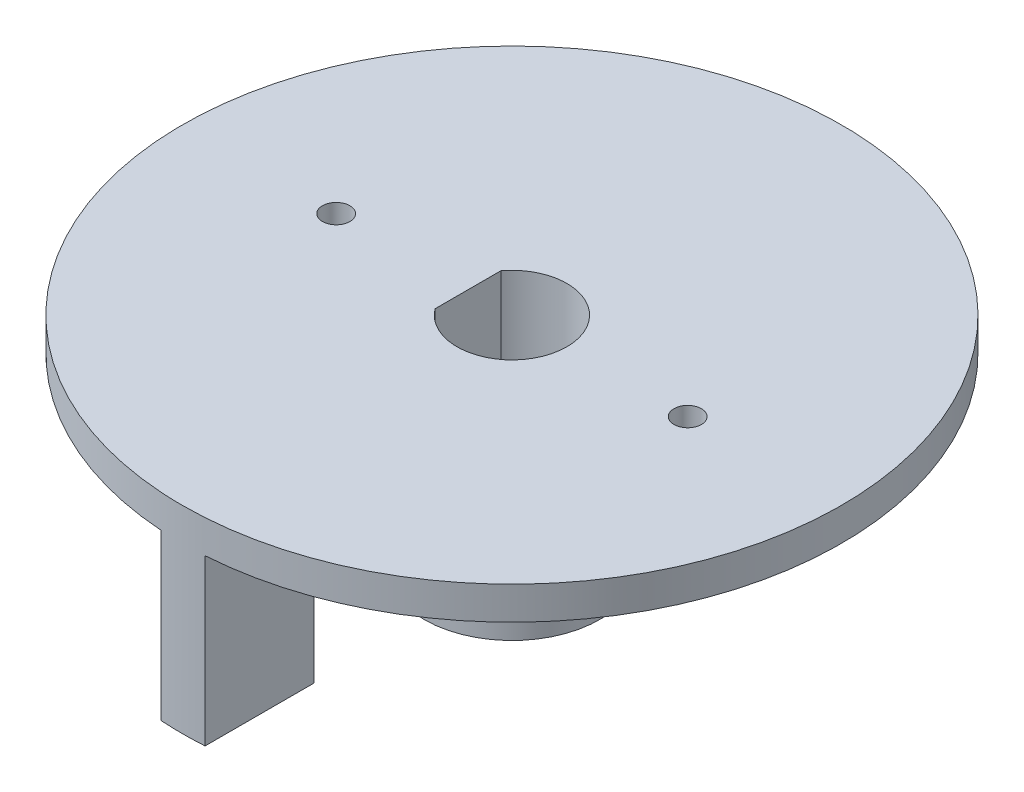
ISO-10303-21;
HEADER;
FILE_DESCRIPTION(('STEP AP214'),'2;1');
FILE_NAME('part.step','',(''),(''),'','','');
FILE_SCHEMA(('AUTOMOTIVE_DESIGN { 1 0 10303 214 1 1 1 1 }'));
ENDSEC;
DATA;
#1=APPLICATION_CONTEXT('core data for automotive mechanical design processes');
#2=APPLICATION_PROTOCOL_DEFINITION('international standard','automotive_design',2000,#1);
#3=PRODUCT_CONTEXT('',#1,'mechanical');
#4=PRODUCT('Part','Part','',(#3));
#5=PRODUCT_RELATED_PRODUCT_CATEGORY('part','',(#4));
#6=PRODUCT_DEFINITION_FORMATION('','',#4);
#7=PRODUCT_DEFINITION_CONTEXT('part definition',#1,'design');
#8=PRODUCT_DEFINITION('design','',#6,#7);
#9=PRODUCT_DEFINITION_SHAPE('','',#8);
#10=(LENGTH_UNIT() NAMED_UNIT(*) SI_UNIT(.MILLI.,.METRE.));
#11=(NAMED_UNIT(*) PLANE_ANGLE_UNIT() SI_UNIT($,.RADIAN.));
#12=(NAMED_UNIT(*) SI_UNIT($,.STERADIAN.) SOLID_ANGLE_UNIT());
#13=UNCERTAINTY_MEASURE_WITH_UNIT(LENGTH_MEASURE(1.E-05),#10,'distance_accuracy_value','');
#14=(GEOMETRIC_REPRESENTATION_CONTEXT(3) GLOBAL_UNCERTAINTY_ASSIGNED_CONTEXT((#13)) GLOBAL_UNIT_ASSIGNED_CONTEXT((#10,
#11,#12)) REPRESENTATION_CONTEXT('',''));
#15=CARTESIAN_POINT('',(0.,0.,0.));
#16=DIRECTION('',(0.,0.,1.));
#17=DIRECTION('',(1.,0.,0.));
#18=AXIS2_PLACEMENT_3D('',#15,#16,#17);
#19=CARTESIAN_POINT('',(0.,17.,0.));
#20=DIRECTION('',(0.,1.,0.));
#21=DIRECTION('',(0.,0.,1.));
#22=AXIS2_PLACEMENT_3D('',#19,#20,#21);
#23=PLANE('',#22);
#24=CARTESIAN_POINT('',(-16.,17.,0.));
#25=DIRECTION('',(0.,1.,0.));
#26=DIRECTION('',(0.,0.,1.));
#27=AXIS2_PLACEMENT_3D('',#24,#25,#26);
#28=CIRCLE('',#27,1.25);
#29=CARTESIAN_POINT('',(-16.,17.,1.25));
#30=VERTEX_POINT('',#29);
#31=EDGE_CURVE('E378',#30,#30,#28,.T.);
#32=ORIENTED_EDGE('',*,*,#31,.T.);
#33=EDGE_LOOP('',(#32));
#34=FACE_BOUND('',#33,.T.);
#35=CARTESIAN_POINT('',(16.,17.,0.));
#36=DIRECTION('',(0.,1.,0.));
#37=DIRECTION('',(0.,0.,1.));
#38=AXIS2_PLACEMENT_3D('',#35,#36,#37);
#39=CIRCLE('',#38,1.25);
#40=CARTESIAN_POINT('',(16.,17.,1.25000000000001));
#41=VERTEX_POINT('',#40);
#42=EDGE_CURVE('E382',#41,#41,#39,.T.);
#43=ORIENTED_EDGE('',*,*,#42,.T.);
#44=EDGE_LOOP('',(#43));
#45=FACE_BOUND('',#44,.T.);
#46=CARTESIAN_POINT('',(0.,17.,0.));
#47=DIRECTION('',(0.,1.,0.));
#48=DIRECTION('',(0.,0.,1.));
#49=AXIS2_PLACEMENT_3D('',#46,#47,#48);
#50=CIRCLE('',#49,11.);
#51=CARTESIAN_POINT('',(0.,17.,11.));
#52=VERTEX_POINT('',#51);
#53=EDGE_CURVE('E53',#52,#52,#50,.T.);
#54=ORIENTED_EDGE('',*,*,#53,.T.);
#55=EDGE_LOOP('',(#54));
#56=FACE_BOUND('',#55,.T.);
#57=DIRECTION('',(0.,0.,1.));
#58=VECTOR('',#57,1.);
#59=CARTESIAN_POINT('',(2.,17.,20.));
#60=LINE('',#59,#58);
#61=CARTESIAN_POINT('',(2.,17.,20.));
#62=VERTEX_POINT('',#61);
#63=CARTESIAN_POINT('',(2.,17.,29.9332590941915));
#64=VERTEX_POINT('',#63);
#65=EDGE_CURVE('E117',#62,#64,#60,.T.);
#66=ORIENTED_EDGE('',*,*,#65,.F.);
#67=DIRECTION('',(1.,0.,0.));
#68=VECTOR('',#67,1.);
#69=CARTESIAN_POINT('',(-2.,17.,20.));
#70=LINE('',#69,#68);
#71=CARTESIAN_POINT('',(-2.,17.,20.));
#72=VERTEX_POINT('',#71);
#73=EDGE_CURVE('E62',#72,#62,#70,.T.);
#74=ORIENTED_EDGE('',*,*,#73,.F.);
#75=DIRECTION('',(0.,0.,-1.));
#76=VECTOR('',#75,1.);
#77=CARTESIAN_POINT('',(-2.,17.,29.9332590941915));
#78=LINE('',#77,#76);
#79=CARTESIAN_POINT('',(-2.,17.,29.9332590941915));
#80=VERTEX_POINT('',#79);
#81=EDGE_CURVE('E63',#80,#72,#78,.T.);
#82=ORIENTED_EDGE('',*,*,#81,.F.);
#83=CARTESIAN_POINT('',(0.,17.,0.));
#84=DIRECTION('',(0.,1.,0.));
#85=DIRECTION('',(0.,0.,1.));
#86=AXIS2_PLACEMENT_3D('',#83,#84,#85);
#87=CIRCLE('',#86,30.);
#88=EDGE_CURVE('E122',#64,#80,#87,.T.);
#89=ORIENTED_EDGE('',*,*,#88,.F.);
#90=EDGE_LOOP('',(#66,#74,#82,#89));
#91=FACE_BOUND('',#90,.T.);
#92=ADVANCED_FACE('F44',(#34,#45,#56,#91),#23,.F.);
#93=CARTESIAN_POINT('',(0.,17.,0.));
#94=DIRECTION('',(0.,-1.,0.));
#95=DIRECTION('',(0.,0.,-1.));
#96=AXIS2_PLACEMENT_3D('',#93,#94,#95);
#97=CYLINDRICAL_SURFACE('',#96,8.);
#98=CARTESIAN_POINT('',(0.,14.,0.));
#99=DIRECTION('',(0.,1.,0.));
#100=DIRECTION('',(0.,0.,1.));
#101=AXIS2_PLACEMENT_3D('',#98,#99,#100);
#102=CIRCLE('',#101,8.);
#103=CARTESIAN_POINT('',(0.,14.,8.));
#104=VERTEX_POINT('',#103);
#105=EDGE_CURVE('E11',#104,#104,#102,.F.);
#106=ORIENTED_EDGE('',*,*,#105,.T.);
#107=EDGE_LOOP('',(#106));
#108=FACE_BOUND('',#107,.T.);
#109=CARTESIAN_POINT('',(-7.91691227689179,10.,-1.15));
#110=CARTESIAN_POINT('',(-7.91691331520906,10.0642369391452,-1.14999732438545));
#111=CARTESIAN_POINT('',(-7.91770254931004,10.128511931939,-1.144599569323));
#112=CARTESIAN_POINT('',(-7.92077232494378,10.2552670699662,-1.1231556401071));
#113=CARTESIAN_POINT('',(-7.92305434871607,10.3177453667638,-1.10709888204727));
#114=CARTESIAN_POINT('',(-7.9288460143981,10.439053894653,-1.06482535284323));
#115=CARTESIAN_POINT('',(-7.93235474310169,10.497886801264,-1.03861613801409));
#116=CARTESIAN_POINT('',(-7.94020338539103,10.6103106271357,-0.976799069701961));
#117=CARTESIAN_POINT('',(-7.94454317718202,10.6639023127763,-0.941192593126768));
#118=CARTESIAN_POINT('',(-7.95360069692159,10.7647259829688,-0.86131160021349));
#119=CARTESIAN_POINT('',(-7.95832072442867,10.8119137863557,-0.816981573552691));
#120=CARTESIAN_POINT('',(-7.96758632503875,10.8982076555134,-0.721031642933757));
#121=CARTESIAN_POINT('',(-7.97213188878928,10.9373132885147,-0.66941134885869));
#122=CARTESIAN_POINT('',(-7.98056033885178,11.0064946675033,-0.56006443667014));
#123=CARTESIAN_POINT('',(-7.98444021937064,11.0365298980851,-0.502311933930787));
#124=CARTESIAN_POINT('',(-7.99107472364296,11.0864580183223,-0.382517036458336));
#125=CARTESIAN_POINT('',(-7.99382940210799,11.1063514011243,-0.320474850477416));
#126=CARTESIAN_POINT('',(-7.99788690770617,11.1352976609833,-0.194316061864047));
#127=CARTESIAN_POINT('',(-7.99919962364701,11.1444244067257,-0.130216731061572));
#128=CARTESIAN_POINT('',(-8.00025915735781,11.1518075687,-0.00138385812618422));
#129=CARTESIAN_POINT('',(-8.00000605540388,11.1500645422018,0.0633496513238747));
#130=CARTESIAN_POINT('',(-7.99797039844107,11.1358161725996,0.19110973215991));
#131=CARTESIAN_POINT('',(-7.99619913641842,11.1233902928918,0.254145371074535));
#132=CARTESIAN_POINT('',(-7.9913387737999,11.0882535369491,0.377227395159526));
#133=CARTESIAN_POINT('',(-7.98824964156645,11.0655424137997,0.43727370852768));
#134=CARTESIAN_POINT('',(-7.9810811912617,11.010397670316,0.552914565752285));
#135=CARTESIAN_POINT('',(-7.97699845038006,10.9779303488046,0.608492817988313));
#136=CARTESIAN_POINT('',(-7.96829827749924,10.9042194162766,0.713442226508403));
#137=CARTESIAN_POINT('',(-7.96368081314635,10.8629752740873,0.762813006828844));
#138=CARTESIAN_POINT('',(-7.95437739097788,10.7724381497289,0.854414022190045));
#139=CARTESIAN_POINT('',(-7.94969119123861,10.7230758202025,0.896575720017902));
#140=CARTESIAN_POINT('',(-7.94081927869157,10.6179398365453,0.972027236299373));
#141=CARTESIAN_POINT('',(-7.93663356850871,10.562166148792,1.00531700822374));
#142=CARTESIAN_POINT('',(-7.92923667281946,10.4457219948527,1.06208752193494));
#143=CARTESIAN_POINT('',(-7.92602614627103,10.3850482524587,1.08556163503201));
#144=CARTESIAN_POINT('',(-7.92095508424149,10.260563173039,1.12196772770523));
#145=CARTESIAN_POINT('',(-7.91909446174244,10.1967520385402,1.13490038681458));
#146=CARTESIAN_POINT('',(-7.9169502367997,10.0684121306809,1.14976332897848));
#147=CARTESIAN_POINT('',(-7.91665273604437,10.0038948110501,1.15179058004305));
#148=CARTESIAN_POINT('',(-7.917631578822,9.87544138112265,1.14504207504783));
#149=CARTESIAN_POINT('',(-7.91890787763385,9.81150525436278,1.13626662595777));
#150=CARTESIAN_POINT('',(-7.92287776940873,9.68632690464793,1.10824390898525));
#151=CARTESIAN_POINT('',(-7.92556487113637,9.62507372424302,1.08904458862154));
#152=CARTESIAN_POINT('',(-7.93204827407153,9.50665520159963,1.04076886373188));
#153=CARTESIAN_POINT('',(-7.93584462591673,9.44949004612939,1.01169200828278));
#154=CARTESIAN_POINT('',(-7.94415166954795,9.34043452421327,0.944252175782423));
#155=CARTESIAN_POINT('',(-7.94866713182425,9.28858347972317,0.905826209647775));
#156=CARTESIAN_POINT('',(-7.95788909393117,9.19203146004691,0.820866883751198));
#157=CARTESIAN_POINT('',(-7.96259560364705,9.14733085543422,0.774333104060587));
#158=CARTESIAN_POINT('',(-7.97171260025748,9.06600238778433,0.674052940592975));
#159=CARTESIAN_POINT('',(-7.97612055780339,9.0294386434563,0.620254292113599));
#160=CARTESIAN_POINT('',(-7.98410489886545,8.96586770759003,0.50722225924468));
#161=CARTESIAN_POINT('',(-7.98768130359466,8.93886027225935,0.447989013546522));
#162=CARTESIAN_POINT('',(-7.99358845745418,8.89527196617406,0.325972801286979));
#163=CARTESIAN_POINT('',(-7.9959234540396,8.87865550803317,0.26320276201097));
#164=CARTESIAN_POINT('',(-7.99910248180935,8.85620549225942,0.135727447514538));
#165=CARTESIAN_POINT('',(-7.99994660309167,8.85037128302245,0.0710222894793985));
#166=CARTESIAN_POINT('',(-8.00004799610185,8.84966628649042,-0.0578635463329459));
#167=CARTESIAN_POINT('',(-7.99931949659493,8.85469719392889,-0.122043696997265));
#168=CARTESIAN_POINT('',(-7.99638607905863,8.87536957735531,-0.248635594537574));
#169=CARTESIAN_POINT('',(-7.99418116466139,8.89101102724024,-0.311047345763617));
#170=CARTESIAN_POINT('',(-7.98854149224972,8.93242665306617,-0.432307528846501));
#171=CARTESIAN_POINT('',(-7.98510749368269,8.95819457285321,-0.491158134930688));
#172=CARTESIAN_POINT('',(-7.97738764433545,9.01912131205622,-0.60371581698541));
#173=CARTESIAN_POINT('',(-7.9731017704772,9.05428038589566,-0.657422753551007));
#174=CARTESIAN_POINT('',(-7.96410898303467,9.13334916549099,-0.75866822566991));
#175=CARTESIAN_POINT('',(-7.95939876100549,9.17733163155091,-0.806149649173705));
#176=CARTESIAN_POINT('',(-7.95011317407693,9.27264578478582,-0.893094297455889));
#177=CARTESIAN_POINT('',(-7.94553784114473,9.3239791974343,-0.93255563441878));
#178=CARTESIAN_POINT('',(-7.93701492641049,9.43284645306878,-1.00251998661137));
#179=CARTESIAN_POINT('',(-7.93307068841188,9.49041077881782,-1.03297596507993));
#180=CARTESIAN_POINT('',(-7.92629570196202,9.60986576546222,-1.08374265513803));
#181=CARTESIAN_POINT('',(-7.92346378374618,9.671751800325,-1.10406403082401));
#182=CARTESIAN_POINT('',(-7.91989732670178,9.77827300933789,-1.12930466202304));
#183=CARTESIAN_POINT('',(-7.91878377047932,9.82224625577588,-1.13705373329637));
#184=CARTESIAN_POINT('',(-7.9172908892521,9.91080688986944,-1.14740230194516));
#185=CARTESIAN_POINT('',(-7.91691155589077,9.95539427052941,-1.15000185793004));
#186=CARTESIAN_POINT('',(-7.91691227689179,10.,-1.15));
#187=B_SPLINE_CURVE_WITH_KNOTS('',3,(#109,#110,#111,#112,#113,#114,#115,#116,#117,#118,#119,
#120,#121,#122,#123,#124,#125,#126,#127,#128,#129,#130,#131,#132,#133,#134,#135,#136,#137,#138,
#139,#140,#141,#142,#143,#144,#145,#146,#147,#148,#149,#150,#151,#152,#153,#154,#155,#156,#157,
#158,#159,#160,#161,#162,#163,#164,#165,#166,#167,#168,#169,#170,#171,#172,#173,#174,#175,#176,
#177,#178,#179,#180,#181,#182,#183,#184,#185,#186),.UNSPECIFIED.,.T.,.F.,(4,2,2,2,2,2,2,2,2,2,2,
2,2,2,2,2,2,2,2,2,2,2,2,2,2,2,2,2,2,2,2,2,2,2,2,2,2,2,4),(0.,0.192547802727428,
0.385287083242156,0.577883185701594,0.770451084201402,0.964286461193185,1.15813221464038,
1.35283144395627,1.54752120513244,1.74086730624846,1.9342034950085,2.12611389197712,
2.31802889632255,2.51061461283076,2.7032119879307,2.89754929303181,3.09188761732436,
3.28635697062763,3.48081378687142,3.67353865108837,3.86625803895856,4.0580983789082,
4.24994747781238,4.44312679663756,4.63631612379153,4.83097775013039,5.025634410069,
5.21962069838394,5.41359526313374,5.60582214462904,5.79804855322802,5.99015639018081,
6.18226943221281,6.3760371284012,6.56985038208814,6.76465876858941,6.95926173392454,
7.09296724772435,7.22667123974062),.UNSPECIFIED.);
#188=CARTESIAN_POINT('',(-7.91691227689179,10.,-1.15));
#189=VERTEX_POINT('',#188);
#190=EDGE_CURVE('E163',#189,#189,#187,.T.);
#191=ORIENTED_EDGE('',*,*,#190,.T.);
#192=EDGE_LOOP('',(#191));
#193=FACE_BOUND('',#192,.T.);
#194=CARTESIAN_POINT('',(7.91691227689179,10.,-1.15));
#195=CARTESIAN_POINT('',(7.91691331520905,9.93576306085483,-1.14999732438545));
#196=CARTESIAN_POINT('',(7.91770254931004,9.87148806806104,-1.144599569323));
#197=CARTESIAN_POINT('',(7.92077232494378,9.74473293003376,-1.1231556401071));
#198=CARTESIAN_POINT('',(7.92305434871607,9.68225463323622,-1.10709888204727));
#199=CARTESIAN_POINT('',(7.9288460143981,9.56094610534705,-1.06482535284323));
#200=CARTESIAN_POINT('',(7.93235474310169,9.50211319873597,-1.03861613801409));
#201=CARTESIAN_POINT('',(7.94020338539103,9.38968937286432,-0.976799069701963));
#202=CARTESIAN_POINT('',(7.94454317718202,9.33609768722372,-0.941192593126769));
#203=CARTESIAN_POINT('',(7.95360069692159,9.23527401703117,-0.861311600213492));
#204=CARTESIAN_POINT('',(7.95832072442867,9.18808621364425,-0.816981573552694));
#205=CARTESIAN_POINT('',(7.96758632503875,9.10179234448665,-0.72103164293376));
#206=CARTESIAN_POINT('',(7.97213188878928,9.06268671148526,-0.669411348858693));
#207=CARTESIAN_POINT('',(7.98056033885178,8.99350533249667,-0.560064436670143));
#208=CARTESIAN_POINT('',(7.98444021937064,8.96347010191487,-0.502311933930789));
#209=CARTESIAN_POINT('',(7.99107472364296,8.91354198167773,-0.382517036458339));
#210=CARTESIAN_POINT('',(7.99382940210799,8.89364859887574,-0.32047485047742));
#211=CARTESIAN_POINT('',(7.99788690770617,8.86470233901671,-0.194316061864051));
#212=CARTESIAN_POINT('',(7.99919962364701,8.85557559327434,-0.130216731061576));
#213=CARTESIAN_POINT('',(8.00025915735781,8.84819243129995,-0.0013838581261874));
#214=CARTESIAN_POINT('',(8.00000605540388,8.84993545779816,0.0633496513238719));
#215=CARTESIAN_POINT('',(7.99797039844107,8.86418382740039,0.191109732159908));
#216=CARTESIAN_POINT('',(7.99619913641842,8.87660970710822,0.254145371074533));
#217=CARTESIAN_POINT('',(7.9913387737999,8.91174646305086,0.377227395159525));
#218=CARTESIAN_POINT('',(7.98824964156645,8.93445758620027,0.437273708527679));
#219=CARTESIAN_POINT('',(7.9810811912617,8.98960232968403,0.552914565752284));
#220=CARTESIAN_POINT('',(7.97699845038006,9.02206965119535,0.608492817988312));
#221=CARTESIAN_POINT('',(7.96829827749924,9.09578058372338,0.713442226508403));
#222=CARTESIAN_POINT('',(7.96368081314635,9.13702472591271,0.762813006828844));
#223=CARTESIAN_POINT('',(7.95437739097788,9.22756185027114,0.854414022190045));
#224=CARTESIAN_POINT('',(7.94969119123861,9.27692417979753,0.896575720017901));
#225=CARTESIAN_POINT('',(7.94081927869157,9.38206016345471,0.972027236299372));
#226=CARTESIAN_POINT('',(7.93663356850871,9.43783385120797,1.00531700822374));
#227=CARTESIAN_POINT('',(7.92923667281946,9.55427800514728,1.06208752193494));
#228=CARTESIAN_POINT('',(7.92602614627103,9.61495174754131,1.08556163503201));
#229=CARTESIAN_POINT('',(7.92095508424149,9.73943682696095,1.12196772770523));
#230=CARTESIAN_POINT('',(7.91909446174244,9.80324796145979,1.13490038681458));
#231=CARTESIAN_POINT('',(7.9169502367997,9.93158786931909,1.14976332897848));
#232=CARTESIAN_POINT('',(7.91665273604437,9.99610518894987,1.15179058004305));
#233=CARTESIAN_POINT('',(7.917631578822,10.1245586188773,1.14504207504784));
#234=CARTESIAN_POINT('',(7.91890787763385,10.1884947456372,1.13626662595778));
#235=CARTESIAN_POINT('',(7.92287776940873,10.3136730953521,1.10824390898525));
#236=CARTESIAN_POINT('',(7.92556487113637,10.374926275757,1.08904458862154));
#237=CARTESIAN_POINT('',(7.93204827407153,10.4933447984004,1.04076886373188));
#238=CARTESIAN_POINT('',(7.93584462591673,10.5505099538706,1.01169200828278));
#239=CARTESIAN_POINT('',(7.94415166954795,10.6595654757867,0.944252175782426));
#240=CARTESIAN_POINT('',(7.94866713182425,10.7114165202768,0.905826209647778));
#241=CARTESIAN_POINT('',(7.95788909393117,10.8079685399531,0.8208668837512));
#242=CARTESIAN_POINT('',(7.96259560364705,10.8526691445658,0.77433310406059));
#243=CARTESIAN_POINT('',(7.97171260025748,10.9339976122157,0.674052940592977));
#244=CARTESIAN_POINT('',(7.97612055780339,10.9705613565437,0.620254292113601));
#245=CARTESIAN_POINT('',(7.98410489886545,11.03413229241,0.507222259244682));
#246=CARTESIAN_POINT('',(7.98768130359466,11.0611397277407,0.447989013546524));
#247=CARTESIAN_POINT('',(7.99358845745418,11.1047280338259,0.325972801286981));
#248=CARTESIAN_POINT('',(7.9959234540396,11.1213444919668,0.263202762010973));
#249=CARTESIAN_POINT('',(7.99910248180935,11.1437945077406,0.135727447514541));
#250=CARTESIAN_POINT('',(7.99994660309167,11.1496287169776,0.0710222894794016));
#251=CARTESIAN_POINT('',(8.00004799610185,11.1503337135096,-0.0578635463329428));
#252=CARTESIAN_POINT('',(7.99931949659493,11.1453028060711,-0.122043696997262));
#253=CARTESIAN_POINT('',(7.99638607905863,11.1246304226447,-0.248635594537572));
#254=CARTESIAN_POINT('',(7.99418116466139,11.1089889727598,-0.311047345763615));
#255=CARTESIAN_POINT('',(7.98854149224972,11.0675733469338,-0.432307528846499));
#256=CARTESIAN_POINT('',(7.98510749368269,11.0418054271468,-0.491158134930686));
#257=CARTESIAN_POINT('',(7.97738764433545,10.9808786879438,-0.603715816985409));
#258=CARTESIAN_POINT('',(7.9731017704772,10.9457196141043,-0.657422753551006));
#259=CARTESIAN_POINT('',(7.96410898303467,10.866650834509,-0.75866822566991));
#260=CARTESIAN_POINT('',(7.95939876100549,10.8226683684491,-0.806149649173704));
#261=CARTESIAN_POINT('',(7.95011317407693,10.7273542152142,-0.893094297455889));
#262=CARTESIAN_POINT('',(7.94553784114473,10.6760208025657,-0.93255563441878));
#263=CARTESIAN_POINT('',(7.93701492641049,10.5671535469312,-1.00251998661137));
#264=CARTESIAN_POINT('',(7.93307068841188,10.5095892211822,-1.03297596507993));
#265=CARTESIAN_POINT('',(7.92629570196202,10.3901342345378,-1.08374265513803));
#266=CARTESIAN_POINT('',(7.92346378374618,10.328248199675,-1.10406403082401));
#267=CARTESIAN_POINT('',(7.91989732670178,10.2217269906621,-1.12930466202304));
#268=CARTESIAN_POINT('',(7.91878377047932,10.1777537442241,-1.13705373329637));
#269=CARTESIAN_POINT('',(7.9172908892521,10.0891931101306,-1.14740230194516));
#270=CARTESIAN_POINT('',(7.91691155589077,10.0446057294706,-1.15000185793004));
#271=CARTESIAN_POINT('',(7.91691227689179,10.,-1.15));
#272=B_SPLINE_CURVE_WITH_KNOTS('',3,(#194,#195,#196,#197,#198,#199,#200,#201,#202,#203,#204,
#205,#206,#207,#208,#209,#210,#211,#212,#213,#214,#215,#216,#217,#218,#219,#220,#221,#222,#223,
#224,#225,#226,#227,#228,#229,#230,#231,#232,#233,#234,#235,#236,#237,#238,#239,#240,#241,#242,
#243,#244,#245,#246,#247,#248,#249,#250,#251,#252,#253,#254,#255,#256,#257,#258,#259,#260,#261,
#262,#263,#264,#265,#266,#267,#268,#269,#270,#271),.UNSPECIFIED.,.T.,.F.,(4,2,2,2,2,2,2,2,2,2,2,
2,2,2,2,2,2,2,2,2,2,2,2,2,2,2,2,2,2,2,2,2,2,2,2,2,2,2,4),(0.,0.192547802727427,
0.385287083242154,0.57788318570159,0.7704510842014,0.964286461193181,1.15813221464038,
1.35283144395627,1.54752120513244,1.74086730624846,1.93420349500849,2.12611389197712,
2.31802889632255,2.51061461283076,2.7032119879307,2.8975492930318,3.09188761732436,
3.28635697062763,3.48081378687142,3.67353865108837,3.86625803895856,4.0580983789082,
4.24994747781238,4.44312679663756,4.63631612379153,4.83097775013039,5.02563441006899,
5.21962069838394,5.41359526313374,5.60582214462903,5.79804855322801,5.99015639018081,
6.18226943221281,6.3760371284012,6.56985038208814,6.76465876858941,6.95926173392454,
7.09296724772436,7.22667123974062),.UNSPECIFIED.);
#273=CARTESIAN_POINT('',(7.91691227689179,10.,-1.15));
#274=VERTEX_POINT('',#273);
#275=EDGE_CURVE('E145',#274,#274,#272,.T.);
#276=ORIENTED_EDGE('',*,*,#275,.T.);
#277=EDGE_LOOP('',(#276));
#278=FACE_BOUND('',#277,.T.);
#279=CARTESIAN_POINT('',(0.,0.,0.));
#280=DIRECTION('',(0.,1.,0.));
#281=DIRECTION('',(0.,0.,1.));
#282=AXIS2_PLACEMENT_3D('',#279,#280,#281);
#283=CIRCLE('',#282,8.);
#284=CARTESIAN_POINT('',(0.,0.,8.));
#285=VERTEX_POINT('',#284);
#286=EDGE_CURVE('E209',#285,#285,#283,.T.);
#287=ORIENTED_EDGE('',*,*,#286,.T.);
#288=EDGE_LOOP('',(#287));
#289=FACE_BOUND('',#288,.T.);
#290=ADVANCED_FACE('F171',(#108,#193,#278,#289),#97,.T.);
#291=CARTESIAN_POINT('',(0.,0.,0.));
#292=DIRECTION('',(0.,1.,0.));
#293=DIRECTION('',(0.,0.,1.));
#294=AXIS2_PLACEMENT_3D('',#291,#292,#293);
#295=PLANE('',#294);
#296=DIRECTION('',(0.,0.,-1.));
#297=VECTOR('',#296,1.);
#298=CARTESIAN_POINT('',(-4.,0.,3.));
#299=LINE('',#298,#297);
#300=CARTESIAN_POINT('',(-4.,0.,3.));
#301=VERTEX_POINT('',#300);
#302=CARTESIAN_POINT('',(-4.,0.,-3.));
#303=VERTEX_POINT('',#302);
#304=EDGE_CURVE('E248',#301,#303,#299,.T.);
#305=ORIENTED_EDGE('',*,*,#304,.F.);
#306=CARTESIAN_POINT('',(0.,0.,0.));
#307=DIRECTION('',(0.,-1.,0.));
#308=DIRECTION('',(0.,0.,-1.));
#309=AXIS2_PLACEMENT_3D('',#306,#307,#308);
#310=CIRCLE('',#309,5.);
#311=EDGE_CURVE('E166',#303,#301,#310,.T.);
#312=ORIENTED_EDGE('',*,*,#311,.F.);
#313=EDGE_LOOP('',(#305,#312));
#314=FACE_BOUND('',#313,.T.);
#315=ORIENTED_EDGE('',*,*,#286,.F.);
#316=EDGE_LOOP('',(#315));
#317=FACE_BOUND('',#316,.T.);
#318=ADVANCED_FACE('F174',(#314,#317),#295,.F.);
#319=CARTESIAN_POINT('',(0.,20.,0.));
#320=DIRECTION('',(0.,-1.,0.));
#321=DIRECTION('',(0.,0.,-1.));
#322=AXIS2_PLACEMENT_3D('',#319,#320,#321);
#323=CYLINDRICAL_SURFACE('',#322,30.);
#324=CARTESIAN_POINT('',(0.,20.,0.));
#325=DIRECTION('',(0.,1.,0.));
#326=DIRECTION('',(0.,0.,1.));
#327=AXIS2_PLACEMENT_3D('',#324,#325,#326);
#328=CIRCLE('',#327,30.);
#329=CARTESIAN_POINT('',(0.,20.,30.));
#330=VERTEX_POINT('',#329);
#331=EDGE_CURVE('E210',#330,#330,#328,.T.);
#332=ORIENTED_EDGE('',*,*,#331,.F.);
#333=EDGE_LOOP('',(#332));
#334=FACE_BOUND('',#333,.T.);
#335=ORIENTED_EDGE('',*,*,#88,.T.);
#336=DIRECTION('',(0.,1.,0.));
#337=VECTOR('',#336,1.);
#338=CARTESIAN_POINT('',(-2.,2.,29.9332590941915));
#339=LINE('',#338,#337);
#340=CARTESIAN_POINT('',(-2.,2.,29.9332590941915));
#341=VERTEX_POINT('',#340);
#342=EDGE_CURVE('E103',#341,#80,#339,.T.);
#343=ORIENTED_EDGE('',*,*,#342,.F.);
#344=CARTESIAN_POINT('',(0.,2.,0.));
#345=DIRECTION('',(0.,-1.,0.));
#346=DIRECTION('',(0.,0.,-1.));
#347=AXIS2_PLACEMENT_3D('',#344,#345,#346);
#348=CIRCLE('',#347,30.);
#349=CARTESIAN_POINT('',(2.,2.,29.9332590941915));
#350=VERTEX_POINT('',#349);
#351=EDGE_CURVE('E108',#350,#341,#348,.T.);
#352=ORIENTED_EDGE('',*,*,#351,.F.);
#353=DIRECTION('',(0.,1.,0.));
#354=VECTOR('',#353,1.);
#355=CARTESIAN_POINT('',(2.,2.,29.9332590941915));
#356=LINE('',#355,#354);
#357=EDGE_CURVE('E392',#350,#64,#356,.T.);
#358=ORIENTED_EDGE('',*,*,#357,.T.);
#359=EDGE_LOOP('',(#335,#343,#352,#358));
#360=FACE_BOUND('',#359,.T.);
#361=ADVANCED_FACE('F119',(#334,#360),#323,.T.);
#362=CARTESIAN_POINT('',(0.,20.,0.));
#363=DIRECTION('',(0.,1.,0.));
#364=DIRECTION('',(0.,0.,1.));
#365=AXIS2_PLACEMENT_3D('',#362,#363,#364);
#366=PLANE('',#365);
#367=CARTESIAN_POINT('',(-16.,20.,0.));
#368=DIRECTION('',(0.,-1.,0.));
#369=DIRECTION('',(0.,0.,-1.));
#370=AXIS2_PLACEMENT_3D('',#367,#368,#369);
#371=CIRCLE('',#370,1.25);
#372=CARTESIAN_POINT('',(-16.,20.,-1.25));
#373=VERTEX_POINT('',#372);
#374=EDGE_CURVE('E199',#373,#373,#371,.T.);
#375=ORIENTED_EDGE('',*,*,#374,.T.);
#376=EDGE_LOOP('',(#375));
#377=FACE_BOUND('',#376,.T.);
#378=CARTESIAN_POINT('',(16.,20.,0.));
#379=DIRECTION('',(0.,-1.,0.));
#380=DIRECTION('',(0.,0.,1.));
#381=AXIS2_PLACEMENT_3D('',#378,#379,#380);
#382=CIRCLE('',#381,1.25);
#383=CARTESIAN_POINT('',(16.,20.,1.25000000000001));
#384=VERTEX_POINT('',#383);
#385=EDGE_CURVE('E202',#384,#384,#382,.T.);
#386=ORIENTED_EDGE('',*,*,#385,.T.);
#387=EDGE_LOOP('',(#386));
#388=FACE_BOUND('',#387,.T.);
#389=CARTESIAN_POINT('',(0.,20.,0.));
#390=DIRECTION('',(0.,-1.,0.));
#391=DIRECTION('',(0.,0.,-1.));
#392=AXIS2_PLACEMENT_3D('',#389,#390,#391);
#393=CIRCLE('',#392,5.);
#394=CARTESIAN_POINT('',(-4.,20.,-3.));
#395=VERTEX_POINT('',#394);
#396=CARTESIAN_POINT('',(-4.,20.,3.));
#397=VERTEX_POINT('',#396);
#398=EDGE_CURVE('E169',#395,#397,#393,.T.);
#399=ORIENTED_EDGE('',*,*,#398,.T.);
#400=DIRECTION('',(0.,0.,-1.));
#401=VECTOR('',#400,1.);
#402=CARTESIAN_POINT('',(-4.,20.,3.));
#403=LINE('',#402,#401);
#404=EDGE_CURVE('E253',#397,#395,#403,.T.);
#405=ORIENTED_EDGE('',*,*,#404,.T.);
#406=EDGE_LOOP('',(#399,#405));
#407=FACE_BOUND('',#406,.T.);
#408=ORIENTED_EDGE('',*,*,#331,.T.);
#409=EDGE_LOOP('',(#408));
#410=FACE_BOUND('',#409,.T.);
#411=ADVANCED_FACE('F182',(#377,#388,#407,#410),#366,.T.);
#412=CARTESIAN_POINT('',(0.,20.,0.));
#413=DIRECTION('',(0.,-1.,0.));
#414=DIRECTION('',(0.,0.,-1.));
#415=AXIS2_PLACEMENT_3D('',#412,#413,#414);
#416=CYLINDRICAL_SURFACE('',#415,5.);
#417=CARTESIAN_POINT('',(4.86595314404074,10.,-1.15));
#418=CARTESIAN_POINT('',(4.8659544227382,10.0636725095996,-1.14999793033143));
#419=CARTESIAN_POINT('',(4.86721653142017,10.1273691783985,-1.14469393098667));
#420=CARTESIAN_POINT('',(4.87211808868897,10.2529449738209,-1.12364492197269));
#421=CARTESIAN_POINT('',(4.87575913908516,10.3148228464406,-1.10789287722779));
#422=CARTESIAN_POINT('',(4.88498489219349,10.4349264732143,-1.06647506858605));
#423=CARTESIAN_POINT('',(4.89056733214939,10.4931563863505,-1.04082084221325));
#424=CARTESIAN_POINT('',(4.90304411205026,10.6044888748284,-0.980360713367411));
#425=CARTESIAN_POINT('',(4.90993845406127,10.6575914420952,-0.945554796481939));
#426=CARTESIAN_POINT('',(4.92440603315068,10.7581529946808,-0.867086592664695));
#427=CARTESIAN_POINT('',(4.93198872140973,10.8055023195589,-0.823285486636309));
#428=CARTESIAN_POINT('',(4.94689614125121,10.8922509396515,-0.728369716980859));
#429=CARTESIAN_POINT('',(4.95422085139519,10.9316495754304,-0.677254447312466));
#430=CARTESIAN_POINT('',(4.96789053008637,11.001817392038,-0.568420481539251));
#431=CARTESIAN_POINT('',(4.97422304463277,11.0324803116758,-0.510631577273057));
#432=CARTESIAN_POINT('',(4.98508770084276,11.0836176357397,-0.390550689138692));
#433=CARTESIAN_POINT('',(4.98962006632429,11.1040933068569,-0.328259266221171));
#434=CARTESIAN_POINT('',(4.9963069527632,11.1339277935062,-0.202082915609417));
#435=CARTESIAN_POINT('',(4.99850117545918,11.143472434696,-0.138244066371473));
#436=CARTESIAN_POINT('',(5.00040237802896,11.1517557177202,-0.00983607620490737));
#437=CARTESIAN_POINT('',(5.00010967124484,11.1504957208909,0.0547329716981643));
#438=CARTESIAN_POINT('',(4.99710006502947,11.1373422536173,0.181484776178881));
#439=CARTESIAN_POINT('',(4.99442885201709,11.1256491735249,0.243689573609646));
#440=CARTESIAN_POINT('',(4.98701480986182,11.0922817484455,0.365229489513027));
#441=CARTESIAN_POINT('',(4.98227188082295,11.0706069221465,0.424564469452764));
#442=CARTESIAN_POINT('',(4.97117508398071,11.0177193161009,0.539226887662188));
#443=CARTESIAN_POINT('',(4.96480872864492,10.9864321972672,0.594518779252278));
#444=CARTESIAN_POINT('',(4.9511606115538,10.9152638757353,0.699139617044627));
#445=CARTESIAN_POINT('',(4.94387871297972,10.8753813879081,0.748467669845325));
#446=CARTESIAN_POINT('',(4.92900034318539,10.7870691050955,0.840953747234896));
#447=CARTESIAN_POINT('',(4.92140048842712,10.7384639830944,0.883943971764816));
#448=CARTESIAN_POINT('',(4.90689823270008,10.6346550029239,0.961196741090861));
#449=CARTESIAN_POINT('',(4.8999958549173,10.5794509255209,0.995458995803806));
#450=CARTESIAN_POINT('',(4.88765991656155,10.4637199638515,1.05436893406212));
#451=CARTESIAN_POINT('',(4.88223167614091,10.4031748180599,1.07898193157513));
#452=CARTESIAN_POINT('',(4.87353014130664,10.2786526009891,1.11763168288899));
#453=CARTESIAN_POINT('',(4.87025646467249,10.2146761406057,1.13167031265108));
#454=CARTESIAN_POINT('',(4.86631348826916,10.086648567157,1.1485063377996));
#455=CARTESIAN_POINT('',(4.86558729085196,10.0226314695516,1.15154936593095));
#456=CARTESIAN_POINT('',(4.86666752651467,9.89500461960382,1.14697541885619));
#457=CARTESIAN_POINT('',(4.86847376556497,9.83139483642896,1.13935926033308));
#458=CARTESIAN_POINT('',(4.87436134747052,9.7072629746614,1.11389706743979));
#459=CARTESIAN_POINT('',(4.87841199398028,9.64671101083241,1.09618896735375));
#460=CARTESIAN_POINT('',(4.88830379120066,9.52943389001888,1.0511961345385));
#461=CARTESIAN_POINT('',(4.8941451278979,9.47270913128673,1.02391040700455));
#462=CARTESIAN_POINT('',(4.90708333211976,9.36364131438934,0.960005125216321));
#463=CARTESIAN_POINT('',(4.91419972788863,9.31138837789092,0.923235796319459));
#464=CARTESIAN_POINT('',(4.92883598568788,9.21370414740639,0.841600723405417));
#465=CARTESIAN_POINT('',(4.93635590329602,9.16827379639709,0.796733862079326));
#466=CARTESIAN_POINT('',(4.95114129121755,9.08455659214247,0.69906026328696));
#467=CARTESIAN_POINT('',(4.95839820989257,9.04643806967658,0.646107726395454));
#468=CARTESIAN_POINT('',(4.97167634181168,8.97963675418595,0.534408855059479));
#469=CARTESIAN_POINT('',(4.97769761570851,8.95095349798102,0.475662805204462));
#470=CARTESIAN_POINT('',(4.98779029281903,8.90406416134451,0.354428132074827));
#471=CARTESIAN_POINT('',(4.99187470215226,8.88578802514892,0.29196773653896));
#472=CARTESIAN_POINT('',(4.99768994659928,8.8600154726861,0.164757706283457));
#473=CARTESIAN_POINT('',(4.99942116216827,8.85251731386618,0.100008443356195));
#474=CARTESIAN_POINT('',(5.00032219010217,8.8485987935285,-0.0283493043009384));
#475=CARTESIAN_POINT('',(4.99954987121792,8.85192816150461,-0.0919498689604096));
#476=CARTESIAN_POINT('',(4.99565609385467,8.86900573938638,-0.217659103616217));
#477=CARTESIAN_POINT('',(4.99253468659409,8.88275372212953,-0.279767806109944));
#478=CARTESIAN_POINT('',(4.98429939404912,8.92015313048931,-0.400512838844004));
#479=CARTESIAN_POINT('',(4.97919334376925,8.94376563986814,-0.459161791641511));
#480=CARTESIAN_POINT('',(4.96753125639337,9.00018711605225,-0.571696942793168));
#481=CARTESIAN_POINT('',(4.96097506304916,9.03299707395462,-0.625582627044282));
#482=CARTESIAN_POINT('',(4.94695517695057,9.10767991213263,-0.728270994583702));
#483=CARTESIAN_POINT('',(4.93947547726797,9.14972671120729,-0.776945014048498));
#484=CARTESIAN_POINT('',(4.92453261194099,9.24134333946815,-0.866631701065723));
#485=CARTESIAN_POINT('',(4.91706945079069,9.29091500714303,-0.907642490846995));
#486=CARTESIAN_POINT('',(4.90287781220891,9.39707708120865,-0.98144093465668));
#487=CARTESIAN_POINT('',(4.89616216346313,9.45376235904625,-1.01409474046342));
#488=CARTESIAN_POINT('',(4.88439075148178,9.57196082468707,-1.06936024934244));
#489=CARTESIAN_POINT('',(4.8793336510164,9.6334700732582,-1.09198004770023));
#490=CARTESIAN_POINT('',(4.8723377347933,9.74582258186909,-1.12272577719224));
#491=CARTESIAN_POINT('',(4.86996011471043,9.79607924722363,-1.13293310320015));
#492=CARTESIAN_POINT('',(4.86676735160216,9.89755209983038,-1.14657084470858));
#493=CARTESIAN_POINT('',(4.86595211518331,9.94876822954458,-1.15000166528359));
#494=CARTESIAN_POINT('',(4.86595314404074,10.,-1.15));
#495=B_SPLINE_CURVE_WITH_KNOTS('',3,(#417,#418,#419,#420,#421,#422,#423,#424,#425,#426,#427,
#428,#429,#430,#431,#432,#433,#434,#435,#436,#437,#438,#439,#440,#441,#442,#443,#444,#445,#446,
#447,#448,#449,#450,#451,#452,#453,#454,#455,#456,#457,#458,#459,#460,#461,#462,#463,#464,#465,
#466,#467,#468,#469,#470,#471,#472,#473,#474,#475,#476,#477,#478,#479,#480,#481,#482,#483,#484,
#485,#486,#487,#488,#489,#490,#491,#492,#493,#494),.UNSPECIFIED.,.T.,.F.,(4,2,2,2,2,2,2,2,2,2,2,
2,2,2,2,2,2,2,2,2,2,2,2,2,2,2,2,2,2,2,2,2,2,2,2,2,2,2,4),(0.,0.190829643700747,0.38178791104742,
0.572524351801529,0.763261092936696,0.957198631120591,1.1511522480117,1.34737315828868,
1.54356966419032,1.7363789026542,1.92916384837032,2.11832379247303,2.3074928586787,
2.49816339633215,2.68886246172552,2.8839429696376,3.07902996040811,3.27481193446187,
3.47055916734146,3.66190555552355,3.85323728397667,4.04201458584763,4.23081150135994,
4.42279518066131,4.61480537042143,4.81081130711499,5.00680762037896,5.20146849115165,
5.39609788616753,5.5862608202159,5.77641960816163,5.96583518684954,6.15527118440031,
6.3486377303959,6.54205159630113,6.73839271553444,6.93457514033522,7.08812845591526,
7.24167259236675),.UNSPECIFIED.);
#496=CARTESIAN_POINT('',(4.86595314404074,10.,-1.15));
#497=VERTEX_POINT('',#496);
#498=EDGE_CURVE('E129',#497,#497,#495,.T.);
#499=ORIENTED_EDGE('',*,*,#498,.T.);
#500=EDGE_LOOP('',(#499));
#501=FACE_BOUND('',#500,.T.);
#502=ORIENTED_EDGE('',*,*,#311,.T.);
#503=DIRECTION('',(0.,-1.,0.));
#504=VECTOR('',#503,1.);
#505=CARTESIAN_POINT('',(-4.,20.,3.));
#506=LINE('',#505,#504);
#507=EDGE_CURVE('E217',#397,#301,#506,.T.);
#508=ORIENTED_EDGE('',*,*,#507,.F.);
#509=ORIENTED_EDGE('',*,*,#398,.F.);
#510=DIRECTION('',(0.,-1.,0.));
#511=VECTOR('',#510,1.);
#512=CARTESIAN_POINT('',(-4.,20.,-3.));
#513=LINE('',#512,#511);
#514=EDGE_CURVE('E213',#395,#303,#513,.T.);
#515=ORIENTED_EDGE('',*,*,#514,.T.);
#516=EDGE_LOOP('',(#502,#508,#509,#515));
#517=FACE_BOUND('',#516,.T.);
#518=ADVANCED_FACE('F150',(#501,#517),#416,.F.);
#519=CARTESIAN_POINT('',(-4.,20.,3.));
#520=DIRECTION('',(-1.,0.,0.));
#521=DIRECTION('',(0.,0.,1.));
#522=AXIS2_PLACEMENT_3D('',#519,#520,#521);
#523=PLANE('',#522);
#524=CARTESIAN_POINT('',(-4.,10.,0.));
#525=DIRECTION('',(-1.,0.,0.));
#526=DIRECTION('',(0.,0.,1.));
#527=AXIS2_PLACEMENT_3D('',#524,#525,#526);
#528=CIRCLE('',#527,1.15);
#529=CARTESIAN_POINT('',(-4.,10.,1.15));
#530=VERTEX_POINT('',#529);
#531=EDGE_CURVE('E124',#530,#530,#528,.T.);
#532=ORIENTED_EDGE('',*,*,#531,.T.);
#533=EDGE_LOOP('',(#532));
#534=FACE_BOUND('',#533,.T.);
#535=ORIENTED_EDGE('',*,*,#304,.T.);
#536=ORIENTED_EDGE('',*,*,#514,.F.);
#537=ORIENTED_EDGE('',*,*,#404,.F.);
#538=ORIENTED_EDGE('',*,*,#507,.T.);
#539=EDGE_LOOP('',(#535,#536,#537,#538));
#540=FACE_BOUND('',#539,.T.);
#541=ADVANCED_FACE('F157',(#534,#540),#523,.F.);
#542=CARTESIAN_POINT('',(-30.,10.,0.));
#543=DIRECTION('',(1.,0.,0.));
#544=DIRECTION('',(0.,0.,-1.));
#545=AXIS2_PLACEMENT_3D('',#542,#543,#544);
#546=CYLINDRICAL_SURFACE('',#545,1.15);
#547=ORIENTED_EDGE('',*,*,#531,.F.);
#548=EDGE_LOOP('',(#547));
#549=FACE_BOUND('',#548,.T.);
#550=ORIENTED_EDGE('',*,*,#190,.F.);
#551=EDGE_LOOP('',(#550));
#552=FACE_BOUND('',#551,.T.);
#553=ADVANCED_FACE('F153',(#549,#552),#546,.F.);
#554=ORIENTED_EDGE('',*,*,#498,.F.);
#555=EDGE_LOOP('',(#554));
#556=FACE_BOUND('',#555,.T.);
#557=ORIENTED_EDGE('',*,*,#275,.F.);
#558=EDGE_LOOP('',(#557));
#559=FACE_BOUND('',#558,.T.);
#560=ADVANCED_FACE('F151',(#556,#559),#546,.F.);
#561=CARTESIAN_POINT('',(-2.,2.,29.9332590941915));
#562=DIRECTION('',(1.,0.,0.));
#563=DIRECTION('',(0.,0.,-1.));
#564=AXIS2_PLACEMENT_3D('',#561,#562,#563);
#565=PLANE('',#564);
#566=ORIENTED_EDGE('',*,*,#81,.T.);
#567=DIRECTION('',(0.,1.,0.));
#568=VECTOR('',#567,1.);
#569=CARTESIAN_POINT('',(-2.,2.,20.));
#570=LINE('',#569,#568);
#571=CARTESIAN_POINT('',(-2.,2.,20.));
#572=VERTEX_POINT('',#571);
#573=EDGE_CURVE('E101',#572,#72,#570,.T.);
#574=ORIENTED_EDGE('',*,*,#573,.F.);
#575=DIRECTION('',(0.,0.,-1.));
#576=VECTOR('',#575,1.);
#577=CARTESIAN_POINT('',(-2.,2.,29.9332590941915));
#578=LINE('',#577,#576);
#579=EDGE_CURVE('E97',#341,#572,#578,.T.);
#580=ORIENTED_EDGE('',*,*,#579,.F.);
#581=ORIENTED_EDGE('',*,*,#342,.T.);
#582=EDGE_LOOP('',(#566,#574,#580,#581));
#583=FACE_BOUND('',#582,.T.);
#584=ADVANCED_FACE('F100',(#583),#565,.F.);
#585=CARTESIAN_POINT('',(-2.,2.,20.));
#586=DIRECTION('',(0.,0.,1.));
#587=DIRECTION('',(1.,0.,0.));
#588=AXIS2_PLACEMENT_3D('',#585,#586,#587);
#589=PLANE('',#588);
#590=ORIENTED_EDGE('',*,*,#73,.T.);
#591=DIRECTION('',(0.,1.,0.));
#592=VECTOR('',#591,1.);
#593=CARTESIAN_POINT('',(2.,2.,20.));
#594=LINE('',#593,#592);
#595=CARTESIAN_POINT('',(2.,2.,20.));
#596=VERTEX_POINT('',#595);
#597=EDGE_CURVE('E128',#596,#62,#594,.T.);
#598=ORIENTED_EDGE('',*,*,#597,.F.);
#599=DIRECTION('',(1.,0.,0.));
#600=VECTOR('',#599,1.);
#601=CARTESIAN_POINT('',(-2.,2.,20.));
#602=LINE('',#601,#600);
#603=EDGE_CURVE('E110',#572,#596,#602,.T.);
#604=ORIENTED_EDGE('',*,*,#603,.F.);
#605=ORIENTED_EDGE('',*,*,#573,.T.);
#606=EDGE_LOOP('',(#590,#598,#604,#605));
#607=FACE_BOUND('',#606,.T.);
#608=ADVANCED_FACE('F296',(#607),#589,.F.);
#609=CARTESIAN_POINT('',(2.,2.,20.));
#610=DIRECTION('',(-1.,0.,0.));
#611=DIRECTION('',(0.,0.,1.));
#612=AXIS2_PLACEMENT_3D('',#609,#610,#611);
#613=PLANE('',#612);
#614=ORIENTED_EDGE('',*,*,#65,.T.);
#615=ORIENTED_EDGE('',*,*,#357,.F.);
#616=DIRECTION('',(0.,0.,1.));
#617=VECTOR('',#616,1.);
#618=CARTESIAN_POINT('',(2.,2.,20.));
#619=LINE('',#618,#617);
#620=EDGE_CURVE('E113',#596,#350,#619,.T.);
#621=ORIENTED_EDGE('',*,*,#620,.F.);
#622=ORIENTED_EDGE('',*,*,#597,.T.);
#623=EDGE_LOOP('',(#614,#615,#621,#622));
#624=FACE_BOUND('',#623,.T.);
#625=ADVANCED_FACE('F234',(#624),#613,.F.);
#626=CARTESIAN_POINT('',(0.,2.,0.));
#627=DIRECTION('',(0.,-1.,0.));
#628=DIRECTION('',(0.,0.,-1.));
#629=AXIS2_PLACEMENT_3D('',#626,#627,#628);
#630=PLANE('',#629);
#631=ORIENTED_EDGE('',*,*,#351,.T.);
#632=ORIENTED_EDGE('',*,*,#579,.T.);
#633=ORIENTED_EDGE('',*,*,#603,.T.);
#634=ORIENTED_EDGE('',*,*,#620,.T.);
#635=EDGE_LOOP('',(#631,#632,#633,#634));
#636=FACE_BOUND('',#635,.T.);
#637=ADVANCED_FACE('F111',(#636),#630,.T.);
#638=CARTESIAN_POINT('',(0.,14.,0.));
#639=DIRECTION('',(0.,1.,0.));
#640=DIRECTION('',(0.,0.,1.));
#641=AXIS2_PLACEMENT_3D('',#638,#639,#640);
#642=TOROIDAL_SURFACE('',#641,11.,3.);
#643=ORIENTED_EDGE('',*,*,#105,.F.);
#644=EDGE_LOOP('',(#643));
#645=FACE_BOUND('',#644,.T.);
#646=ORIENTED_EDGE('',*,*,#53,.F.);
#647=EDGE_LOOP('',(#646));
#648=FACE_BOUND('',#647,.T.);
#649=ADVANCED_FACE('F50',(#645,#648),#642,.F.);
#650=CARTESIAN_POINT('',(16.,20.,0.));
#651=DIRECTION('',(0.,-1.,0.));
#652=DIRECTION('',(0.,0.,-1.));
#653=AXIS2_PLACEMENT_3D('',#650,#651,#652);
#654=CYLINDRICAL_SURFACE('',#653,1.25);
#655=ORIENTED_EDGE('',*,*,#385,.F.);
#656=EDGE_LOOP('',(#655));
#657=FACE_BOUND('',#656,.T.);
#658=ORIENTED_EDGE('',*,*,#42,.F.);
#659=EDGE_LOOP('',(#658));
#660=FACE_BOUND('',#659,.T.);
#661=ADVANCED_FACE('F228',(#657,#660),#654,.F.);
#662=CARTESIAN_POINT('',(-16.,20.,0.));
#663=DIRECTION('',(0.,-1.,0.));
#664=DIRECTION('',(0.,0.,-1.));
#665=AXIS2_PLACEMENT_3D('',#662,#663,#664);
#666=CYLINDRICAL_SURFACE('',#665,1.25);
#667=ORIENTED_EDGE('',*,*,#374,.F.);
#668=EDGE_LOOP('',(#667));
#669=FACE_BOUND('',#668,.T.);
#670=ORIENTED_EDGE('',*,*,#31,.F.);
#671=EDGE_LOOP('',(#670));
#672=FACE_BOUND('',#671,.T.);
#673=ADVANCED_FACE('F229',(#669,#672),#666,.F.);
#674=CLOSED_SHELL('',(#92,#290,#318,#361,#411,#518,#541,#553,#560,#584,#608,#625,#637,#649,#661,#673));
#675=MANIFOLD_SOLID_BREP('B2',#674);
#676=ADVANCED_BREP_SHAPE_REPRESENTATION('',(#18,#675),#14);
#677=SHAPE_DEFINITION_REPRESENTATION(#9,#676);
ENDSEC;
END-ISO-10303-21;
